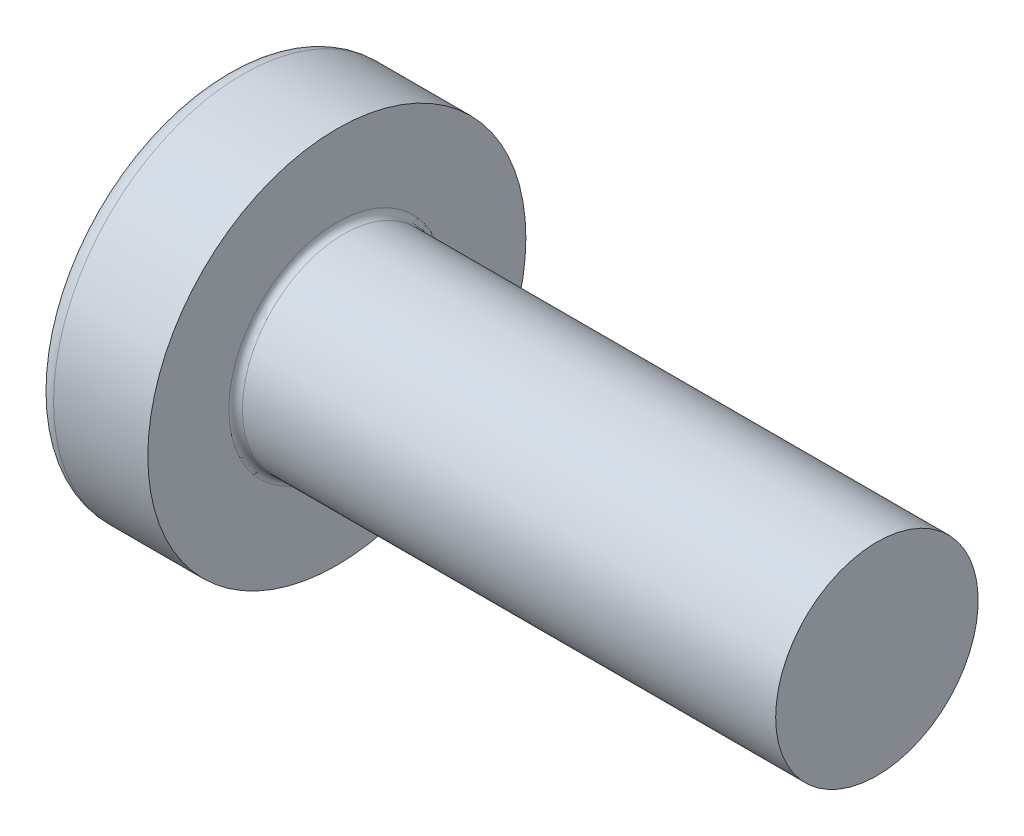
ISO-10303-21;
HEADER;
FILE_DESCRIPTION(('STEP AP214'),'2;1');
FILE_NAME('part.step','',(''),(''),'','','');
FILE_SCHEMA(('AUTOMOTIVE_DESIGN { 1 0 10303 214 1 1 1 1 }'));
ENDSEC;
DATA;
#1=APPLICATION_CONTEXT('core data for automotive mechanical design processes');
#2=APPLICATION_PROTOCOL_DEFINITION('international standard','automotive_design',2000,#1);
#3=PRODUCT_CONTEXT('',#1,'mechanical');
#4=PRODUCT('Part','Part','',(#3));
#5=PRODUCT_RELATED_PRODUCT_CATEGORY('part','',(#4));
#6=PRODUCT_DEFINITION_FORMATION('','',#4);
#7=PRODUCT_DEFINITION_CONTEXT('part definition',#1,'design');
#8=PRODUCT_DEFINITION('design','',#6,#7);
#9=PRODUCT_DEFINITION_SHAPE('','',#8);
#10=(LENGTH_UNIT() NAMED_UNIT(*) SI_UNIT(.MILLI.,.METRE.));
#11=(NAMED_UNIT(*) PLANE_ANGLE_UNIT() SI_UNIT($,.RADIAN.));
#12=(NAMED_UNIT(*) SI_UNIT($,.STERADIAN.) SOLID_ANGLE_UNIT());
#13=UNCERTAINTY_MEASURE_WITH_UNIT(LENGTH_MEASURE(1.E-05),#10,'distance_accuracy_value','');
#14=(GEOMETRIC_REPRESENTATION_CONTEXT(3) GLOBAL_UNCERTAINTY_ASSIGNED_CONTEXT((#13)) GLOBAL_UNIT_ASSIGNED_CONTEXT((#10,
#11,#12)) REPRESENTATION_CONTEXT('',''));
#15=CARTESIAN_POINT('',(0.,0.,0.));
#16=DIRECTION('',(0.,0.,1.));
#17=DIRECTION('',(1.,0.,0.));
#18=AXIS2_PLACEMENT_3D('',#15,#16,#17);
#19=CARTESIAN_POINT('',(5.,0.,0.));
#20=DIRECTION('',(-1.,0.,0.));
#21=DIRECTION('',(0.,1.,0.));
#22=AXIS2_PLACEMENT_3D('',#19,#20,#21);
#23=SPHERICAL_SURFACE('',#22,5.);
#24=CARTESIAN_POINT('',(0.775371598933733,0.,0.));
#25=DIRECTION('',(-1.,0.,0.));
#26=DIRECTION('',(0.,0.,1.));
#27=AXIS2_PLACEMENT_3D('',#24,#25,#26);
#28=CIRCLE('',#27,2.67441860465116);
#29=CARTESIAN_POINT('',(0.775371598933733,0.,2.67441860465116));
#30=VERTEX_POINT('',#29);
#31=EDGE_CURVE('E237',#30,#30,#28,.T.);
#32=ORIENTED_EDGE('',*,*,#31,.T.);
#33=EDGE_LOOP('',(#32));
#34=FACE_BOUND('',#33,.T.);
#35=CARTESIAN_POINT('',(0.0457951200896417,0.,0.));
#36=DIRECTION('',(1.,0.,0.));
#37=DIRECTION('',(0.,0.,-1.));
#38=AXIS2_PLACEMENT_3D('',#35,#36,#37);
#39=CIRCLE('',#38,0.675169614150692);
#40=CARTESIAN_POINT('',(0.0457951200896434,-0.369999999999998,-0.564760133040918));
#41=VERTEX_POINT('',#40);
#42=CARTESIAN_POINT('',(0.0457951200896417,-0.564760133040916,-0.37));
#43=VERTEX_POINT('',#42);
#44=EDGE_CURVE('E373',#41,#43,#39,.F.);
#45=ORIENTED_EDGE('',*,*,#44,.F.);
#46=CARTESIAN_POINT('',(5.,-0.37,0.));
#47=DIRECTION('',(0.,1.,0.));
#48=DIRECTION('',(0.,0.,1.));
#49=AXIS2_PLACEMENT_3D('',#46,#47,#48);
#50=CIRCLE('',#49,4.98629120689917);
#51=CARTESIAN_POINT('',(0.18786973422864,-0.369999999999995,-1.30633162146802));
#52=VERTEX_POINT('',#51);
#53=EDGE_CURVE('E299',#52,#41,#50,.T.);
#54=ORIENTED_EDGE('',*,*,#53,.F.);
#55=CARTESIAN_POINT('',(4.56358262530798,0.,0.87531798330592));
#56=DIRECTION('',(0.446197753347436,0.,-0.894934391398443));
#57=DIRECTION('',(-0.894934391398442,0.,-0.446197753347436));
#58=AXIS2_PLACEMENT_3D('',#55,#56,#57);
#59=CIRCLE('',#58,4.90340272700175);
#60=CARTESIAN_POINT('',(0.18786973422864,0.370000000000005,-1.30633162146802));
#61=VERTEX_POINT('',#60);
#62=EDGE_CURVE('E271',#52,#61,#59,.T.);
#63=ORIENTED_EDGE('',*,*,#62,.T.);
#64=CARTESIAN_POINT('',(5.,0.37,0.));
#65=DIRECTION('',(0.,-1.,0.));
#66=DIRECTION('',(0.,0.,-1.));
#67=AXIS2_PLACEMENT_3D('',#64,#65,#66);
#68=CIRCLE('',#67,4.98629120689917);
#69=CARTESIAN_POINT('',(0.0457951200896425,0.370000000000002,-0.564760133040916));
#70=VERTEX_POINT('',#69);
#71=EDGE_CURVE('E326',#70,#61,#68,.T.);
#72=ORIENTED_EDGE('',*,*,#71,.F.);
#73=CARTESIAN_POINT('',(0.0457951200896417,0.564760133040915,-0.37));
#74=VERTEX_POINT('',#73);
#75=EDGE_CURVE('E392',#74,#70,#39,.F.);
#76=ORIENTED_EDGE('',*,*,#75,.F.);
#77=CARTESIAN_POINT('',(5.,0.,-0.37));
#78=DIRECTION('',(0.,0.,1.));
#79=DIRECTION('',(1.,0.,0.));
#80=AXIS2_PLACEMENT_3D('',#77,#78,#79);
#81=CIRCLE('',#80,4.98629120689917);
#82=CARTESIAN_POINT('',(0.18786973422864,1.30633162146802,-0.37));
#83=VERTEX_POINT('',#82);
#84=EDGE_CURVE('E265',#83,#74,#81,.T.);
#85=ORIENTED_EDGE('',*,*,#84,.F.);
#86=CARTESIAN_POINT('',(4.56358262530798,-0.875317983305919,0.));
#87=DIRECTION('',(0.446197753347436,0.894934391398443,0.));
#88=DIRECTION('',(-0.894934391398443,0.446197753347436,0.));
#89=AXIS2_PLACEMENT_3D('',#86,#87,#88);
#90=CIRCLE('',#89,4.90340272700175);
#91=CARTESIAN_POINT('',(0.18786973422864,1.30633162146802,0.37));
#92=VERTEX_POINT('',#91);
#93=EDGE_CURVE('E268',#83,#92,#90,.T.);
#94=ORIENTED_EDGE('',*,*,#93,.T.);
#95=CARTESIAN_POINT('',(5.,0.,0.37));
#96=DIRECTION('',(0.,0.,-1.));
#97=DIRECTION('',(0.,1.,0.));
#98=AXIS2_PLACEMENT_3D('',#95,#96,#97);
#99=CIRCLE('',#98,4.98629120689917);
#100=CARTESIAN_POINT('',(0.0457951200896417,0.564760133040911,0.37));
#101=VERTEX_POINT('',#100);
#102=EDGE_CURVE('E261',#101,#92,#99,.T.);
#103=ORIENTED_EDGE('',*,*,#102,.F.);
#104=CARTESIAN_POINT('',(0.0457951200896434,0.369999999999998,0.564760133040918));
#105=VERTEX_POINT('',#104);
#106=EDGE_CURVE('E391',#105,#101,#39,.F.);
#107=ORIENTED_EDGE('',*,*,#106,.F.);
#108=CARTESIAN_POINT('',(0.187869734228641,0.369999999999995,1.30633162146802));
#109=VERTEX_POINT('',#108);
#110=EDGE_CURVE('E281',#109,#105,#68,.T.);
#111=ORIENTED_EDGE('',*,*,#110,.F.);
#112=CARTESIAN_POINT('',(4.56358262530798,0.,-0.875317983305919));
#113=DIRECTION('',(0.446197753347436,0.,0.894934391398443));
#114=DIRECTION('',(0.894934391398443,0.,-0.446197753347436));
#115=AXIS2_PLACEMENT_3D('',#112,#113,#114);
#116=CIRCLE('',#115,4.90340272700175);
#117=CARTESIAN_POINT('',(0.187869734228641,-0.370000000000005,1.30633162146802));
#118=VERTEX_POINT('',#117);
#119=EDGE_CURVE('E48',#109,#118,#116,.T.);
#120=ORIENTED_EDGE('',*,*,#119,.T.);
#121=CARTESIAN_POINT('',(0.0457951200896429,-0.370000000000002,0.564760133040916));
#122=VERTEX_POINT('',#121);
#123=EDGE_CURVE('E278',#122,#118,#50,.T.);
#124=ORIENTED_EDGE('',*,*,#123,.F.);
#125=CARTESIAN_POINT('',(0.0457951200896417,-0.564760133040912,0.37));
#126=VERTEX_POINT('',#125);
#127=EDGE_CURVE('E427',#126,#122,#39,.F.);
#128=ORIENTED_EDGE('',*,*,#127,.F.);
#129=CARTESIAN_POINT('',(0.18786973422864,-1.30633162146802,0.37));
#130=VERTEX_POINT('',#129);
#131=EDGE_CURVE('E262',#130,#126,#99,.T.);
#132=ORIENTED_EDGE('',*,*,#131,.F.);
#133=CARTESIAN_POINT('',(4.56358262530798,0.87531798330592,0.));
#134=DIRECTION('',(0.446197753347436,-0.894934391398443,0.));
#135=DIRECTION('',(0.894934391398442,0.446197753347436,0.));
#136=AXIS2_PLACEMENT_3D('',#133,#134,#135);
#137=CIRCLE('',#136,4.90340272700175);
#138=CARTESIAN_POINT('',(0.18786973422864,-1.30633162146802,-0.37));
#139=VERTEX_POINT('',#138);
#140=EDGE_CURVE('E258',#130,#139,#137,.T.);
#141=ORIENTED_EDGE('',*,*,#140,.T.);
#142=EDGE_CURVE('E63',#43,#139,#81,.T.);
#143=ORIENTED_EDGE('',*,*,#142,.F.);
#144=EDGE_LOOP('',(#45,#54,#63,#72,#76,#85,#94,#103,#107,#111,#120,#124,#128,#132,#141,#143));
#145=FACE_BOUND('',#144,.T.);
#146=ADVANCED_FACE('F35',(#34,#145),#23,.T.);
#147=CARTESIAN_POINT('',(1.75,0.527482331818931,-0.37));
#148=DIRECTION('',(0.,0.,1.));
#149=DIRECTION('',(1.,0.,0.));
#150=AXIS2_PLACEMENT_3D('',#147,#148,#149);
#151=PLANE('',#150);
#152=ORIENTED_EDGE('',*,*,#84,.T.);
#153=CARTESIAN_POINT('',(-0.987293237053716,0.649401255967161,-0.37));
#154=CARTESIAN_POINT('',(-0.781914975317084,0.632865887002871,-0.37));
#155=CARTESIAN_POINT('',(-0.576547882393372,0.616188977635081,-0.37));
#156=CARTESIAN_POINT('',(-0.165841599226327,0.582441031964227,-0.37));
#157=CARTESIAN_POINT('',(0.0394975903090452,0.56536998705488,-0.37));
#158=CARTESIAN_POINT('',(0.450133475422572,0.530723441326535,-0.37));
#159=CARTESIAN_POINT('',(0.655430171010573,0.513147940624557,-0.37));
#160=CARTESIAN_POINT('',(1.06596140177934,0.477314957985794,-0.37));
#161=CARTESIAN_POINT('',(1.2711959378071,0.459057485806066,-0.37));
#162=CARTESIAN_POINT('',(1.61065292365626,0.428051938688768,-0.37));
#163=CARTESIAN_POINT('',(1.74490059995643,0.415580824990931,-0.37));
#164=CARTESIAN_POINT('',(2.01334321762763,0.390092023404979,-0.37));
#165=CARTESIAN_POINT('',(2.14753815934577,0.377074339177353,-0.37));
#166=CARTESIAN_POINT('',(2.41586354151957,0.350315629452843,-0.37));
#167=CARTESIAN_POINT('',(2.5499939784531,0.33657456817765,-0.37));
#168=CARTESIAN_POINT('',(2.81814173295471,0.308004077741875,-0.37));
#169=CARTESIAN_POINT('',(2.95215904765134,0.293174621747065,-0.37));
#170=CARTESIAN_POINT('',(3.0860955068368,0.277618485071816,-0.37));
#171=B_SPLINE_CURVE_WITH_KNOTS('',3,(#153,#154,#155,#156,#157,#158,#159,#160,#161,#162,#163,
#164,#165,#166,#167,#168,#169,#170),.UNSPECIFIED.,.F.,.F.,(4,2,2,2,2,2,2,2,4),(0.,
0.618128793984691,1.23627109812525,1.85441325887562,2.4725465791681,2.87702276218609,
3.28149623678161,3.68598973550942,4.09049321032311),.UNSPECIFIED.);
#172=CARTESIAN_POINT('',(1.75,0.415013252800437,-0.37));
#173=VERTEX_POINT('',#172);
#174=EDGE_CURVE('E413',#74,#173,#171,.T.);
#175=ORIENTED_EDGE('',*,*,#174,.T.);
#176=DIRECTION('',(0.,1.,0.));
#177=VECTOR('',#176,1.);
#178=CARTESIAN_POINT('',(1.75,-0.527482331818931,-0.37));
#179=LINE('',#178,#177);
#180=CARTESIAN_POINT('',(1.75,0.527482331818932,-0.37));
#181=VERTEX_POINT('',#180);
#182=EDGE_CURVE('E355',#173,#181,#179,.T.);
#183=ORIENTED_EDGE('',*,*,#182,.T.);
#184=DIRECTION('',(0.894934391398442,-0.446197753347436,0.));
#185=VECTOR('',#184,1.);
#186=CARTESIAN_POINT('',(0.,1.4,-0.37));
#187=LINE('',#186,#185);
#188=EDGE_CURVE('E238',#83,#181,#187,.T.);
#189=ORIENTED_EDGE('',*,*,#188,.F.);
#190=EDGE_LOOP('',(#152,#175,#183,#189));
#191=FACE_BOUND('',#190,.T.);
#192=ADVANCED_FACE('F193',(#191),#151,.T.);
#193=CARTESIAN_POINT('',(1.75,-0.527482331818931,-0.37));
#194=VERTEX_POINT('',#193);
#195=CARTESIAN_POINT('',(1.75,-0.415013252800437,-0.37));
#196=VERTEX_POINT('',#195);
#197=EDGE_CURVE('E246',#194,#196,#179,.T.);
#198=ORIENTED_EDGE('',*,*,#197,.T.);
#199=CARTESIAN_POINT('',(-0.987293237053716,-0.649401255967161,-0.37));
#200=CARTESIAN_POINT('',(-0.781914975317084,-0.632865887002871,-0.37));
#201=CARTESIAN_POINT('',(-0.576547882393372,-0.616188977635081,-0.37));
#202=CARTESIAN_POINT('',(-0.165841599226327,-0.582441031964227,-0.37));
#203=CARTESIAN_POINT('',(0.0394975903090452,-0.56536998705488,-0.37));
#204=CARTESIAN_POINT('',(0.450133475422572,-0.530723441326535,-0.37));
#205=CARTESIAN_POINT('',(0.655430171010573,-0.513147940624557,-0.37));
#206=CARTESIAN_POINT('',(1.06596140177934,-0.477314957985794,-0.37));
#207=CARTESIAN_POINT('',(1.2711959378071,-0.459057485806066,-0.37));
#208=CARTESIAN_POINT('',(1.61065292365626,-0.428051938688768,-0.37));
#209=CARTESIAN_POINT('',(1.74490059995643,-0.415580824990931,-0.37));
#210=CARTESIAN_POINT('',(2.01334321762763,-0.390092023404979,-0.37));
#211=CARTESIAN_POINT('',(2.14753815934577,-0.377074339177353,-0.37));
#212=CARTESIAN_POINT('',(2.41586354151957,-0.350315629452843,-0.37));
#213=CARTESIAN_POINT('',(2.5499939784531,-0.33657456817765,-0.37));
#214=CARTESIAN_POINT('',(2.81814173295471,-0.308004077741875,-0.37));
#215=CARTESIAN_POINT('',(2.95215904765134,-0.293174621747065,-0.37));
#216=CARTESIAN_POINT('',(3.0860955068368,-0.277618485071816,-0.37));
#217=B_SPLINE_CURVE_WITH_KNOTS('',3,(#199,#200,#201,#202,#203,#204,#205,#206,#207,#208,#209,
#210,#211,#212,#213,#214,#215,#216),.UNSPECIFIED.,.F.,.F.,(4,2,2,2,2,2,2,2,4),(0.,
0.618128793984691,1.23627109812525,1.85441325887562,2.4725465791681,2.87702276218609,
3.28149623678161,3.68598973550942,4.09049321032311),.UNSPECIFIED.);
#218=EDGE_CURVE('E390',#196,#43,#217,.F.);
#219=ORIENTED_EDGE('',*,*,#218,.T.);
#220=ORIENTED_EDGE('',*,*,#142,.T.);
#221=DIRECTION('',(0.894934391398442,0.446197753347436,0.));
#222=VECTOR('',#221,1.);
#223=CARTESIAN_POINT('',(0.,-1.4,-0.37));
#224=LINE('',#223,#222);
#225=EDGE_CURVE('E329',#139,#194,#224,.T.);
#226=ORIENTED_EDGE('',*,*,#225,.T.);
#227=EDGE_LOOP('',(#198,#219,#220,#226));
#228=FACE_BOUND('',#227,.T.);
#229=ADVANCED_FACE('F199',(#228),#151,.T.);
#230=CARTESIAN_POINT('',(1.75,-0.527482331818931,0.37));
#231=DIRECTION('',(0.,0.,-1.));
#232=DIRECTION('',(0.,1.,0.));
#233=AXIS2_PLACEMENT_3D('',#230,#231,#232);
#234=PLANE('',#233);
#235=DIRECTION('',(0.,-1.,0.));
#236=VECTOR('',#235,1.);
#237=CARTESIAN_POINT('',(1.75,0.527482331818931,0.37));
#238=LINE('',#237,#236);
#239=CARTESIAN_POINT('',(1.75,0.527482331818932,0.37));
#240=VERTEX_POINT('',#239);
#241=CARTESIAN_POINT('',(1.75,0.415013252800437,0.37));
#242=VERTEX_POINT('',#241);
#243=EDGE_CURVE('E338',#240,#242,#238,.T.);
#244=ORIENTED_EDGE('',*,*,#243,.T.);
#245=CARTESIAN_POINT('',(-0.987293237053716,0.649401255967161,0.37));
#246=CARTESIAN_POINT('',(-0.781914975317084,0.632865887002871,0.37));
#247=CARTESIAN_POINT('',(-0.576547882393372,0.616188977635081,0.37));
#248=CARTESIAN_POINT('',(-0.165841599226327,0.582441031964227,0.37));
#249=CARTESIAN_POINT('',(0.0394975903090453,0.56536998705488,0.37));
#250=CARTESIAN_POINT('',(0.450133475422572,0.530723441326535,0.37));
#251=CARTESIAN_POINT('',(0.655430171010574,0.513147940624557,0.37));
#252=CARTESIAN_POINT('',(1.06596140177934,0.477314957985794,0.37));
#253=CARTESIAN_POINT('',(1.2711959378071,0.459057485806066,0.37));
#254=CARTESIAN_POINT('',(1.61065292365626,0.428051938688768,0.37));
#255=CARTESIAN_POINT('',(1.74490059995643,0.415580824990931,0.37));
#256=CARTESIAN_POINT('',(2.01334321762763,0.39009202340498,0.37));
#257=CARTESIAN_POINT('',(2.14753815934577,0.377074339177353,0.37));
#258=CARTESIAN_POINT('',(2.41586354151957,0.350315629452843,0.37));
#259=CARTESIAN_POINT('',(2.5499939784531,0.33657456817765,0.37));
#260=CARTESIAN_POINT('',(2.81814173295471,0.308004077741875,0.37));
#261=CARTESIAN_POINT('',(2.95215904765134,0.293174621747065,0.37));
#262=CARTESIAN_POINT('',(3.0860955068368,0.277618485071816,0.37));
#263=B_SPLINE_CURVE_WITH_KNOTS('',3,(#245,#246,#247,#248,#249,#250,#251,#252,#253,#254,#255,
#256,#257,#258,#259,#260,#261,#262),.UNSPECIFIED.,.F.,.F.,(4,2,2,2,2,2,2,2,4),(0.,
0.618128793984691,1.23627109812525,1.85441325887562,2.4725465791681,2.87702276218609,
3.28149623678161,3.68598973550942,4.09049321032311),.UNSPECIFIED.);
#264=EDGE_CURVE('E665',#242,#101,#263,.F.);
#265=ORIENTED_EDGE('',*,*,#264,.T.);
#266=ORIENTED_EDGE('',*,*,#102,.T.);
#267=DIRECTION('',(0.894934391398442,-0.446197753347436,0.));
#268=VECTOR('',#267,1.);
#269=CARTESIAN_POINT('',(0.,1.4,0.37));
#270=LINE('',#269,#268);
#271=EDGE_CURVE('E243',#92,#240,#270,.T.);
#272=ORIENTED_EDGE('',*,*,#271,.T.);
#273=EDGE_LOOP('',(#244,#265,#266,#272));
#274=FACE_BOUND('',#273,.T.);
#275=ADVANCED_FACE('F409',(#274),#234,.T.);
#276=ORIENTED_EDGE('',*,*,#131,.T.);
#277=CARTESIAN_POINT('',(-0.987293237069635,-0.649401255968442,0.37));
#278=CARTESIAN_POINT('',(-0.781914975331301,-0.632865887004023,0.37));
#279=CARTESIAN_POINT('',(-0.576547882405888,-0.616188977636102,0.37));
#280=CARTESIAN_POINT('',(-0.16584159923544,-0.582441031964983,0.37));
#281=CARTESIAN_POINT('',(0.0394975903016338,-0.5653699870555,0.37));
#282=CARTESIAN_POINT('',(0.450133475420601,-0.530723441326706,0.37));
#283=CARTESIAN_POINT('',(0.655430171012341,-0.513147940624409,0.37));
#284=CARTESIAN_POINT('',(1.06596140178858,-0.477314957984981,0.37));
#285=CARTESIAN_POINT('',(1.27119593782008,-0.459057485804908,0.37));
#286=CARTESIAN_POINT('',(1.61065292367297,-0.428051938687225,0.37));
#287=CARTESIAN_POINT('',(1.74490059997313,-0.415580824989368,0.37));
#288=CARTESIAN_POINT('',(2.01334321764434,-0.390092023403371,0.37));
#289=CARTESIAN_POINT('',(2.14753815936247,-0.377074339175718,0.37));
#290=CARTESIAN_POINT('',(2.41586354153627,-0.350315629451146,0.37));
#291=CARTESIAN_POINT('',(2.54999397846979,-0.336574568175918,0.37));
#292=CARTESIAN_POINT('',(2.8181417329714,-0.308004077740054,0.37));
#293=CARTESIAN_POINT('',(2.95215904766802,-0.29317462174519,0.37));
#294=CARTESIAN_POINT('',(3.08609550685347,-0.277618485069873,0.37));
#295=B_SPLINE_CURVE_WITH_KNOTS('',3,(#277,#278,#279,#280,#281,#282,#283,#284,#285,#286,#287,
#288,#289,#290,#291,#292,#293,#294),.UNSPECIFIED.,.F.,.F.,(4,2,2,2,2,2,2,2,4),(0.,
0.61812879398981,1.23627109813549,1.85441325889711,2.47254657920086,2.87702276221884,
3.28149623681437,3.68598973554218,4.09049321035586),.UNSPECIFIED.);
#296=CARTESIAN_POINT('',(1.75,-0.415013252800437,0.37));
#297=VERTEX_POINT('',#296);
#298=EDGE_CURVE('E428',#126,#297,#295,.T.);
#299=ORIENTED_EDGE('',*,*,#298,.T.);
#300=CARTESIAN_POINT('',(1.75,-0.527482331818931,0.37));
#301=VERTEX_POINT('',#300);
#302=EDGE_CURVE('E340',#297,#301,#238,.T.);
#303=ORIENTED_EDGE('',*,*,#302,.T.);
#304=DIRECTION('',(0.894934391398442,0.446197753347436,0.));
#305=VECTOR('',#304,1.);
#306=CARTESIAN_POINT('',(0.,-1.4,0.37));
#307=LINE('',#306,#305);
#308=EDGE_CURVE('E331',#130,#301,#307,.T.);
#309=ORIENTED_EDGE('',*,*,#308,.F.);
#310=EDGE_LOOP('',(#276,#299,#303,#309));
#311=FACE_BOUND('',#310,.T.);
#312=ADVANCED_FACE('F513',(#311),#234,.T.);
#313=CARTESIAN_POINT('',(1.75,0.527482331818931,0.37));
#314=DIRECTION('',(0.446197753347436,0.894934391398443,0.));
#315=DIRECTION('',(-0.894934391398443,0.446197753347436,0.));
#316=AXIS2_PLACEMENT_3D('',#313,#314,#315);
#317=PLANE('',#316);
#318=CARTESIAN_POINT('',(2.6696526882832,0.0689604923233252,0.));
#319=DIRECTION('',(0.446197753347436,0.894934391398443,0.));
#320=DIRECTION('',(-0.894934391398443,0.446197753347436,0.));
#321=AXIS2_PLACEMENT_3D('',#318,#319,#320);
#322=ELLIPSE('',#321,1.10195897609154,0.486831694838766);
#323=CARTESIAN_POINT('',(1.75,0.527482331818932,0.175779377683681));
#324=VERTEX_POINT('',#323);
#325=CARTESIAN_POINT('',(1.75,0.527482331818932,-0.175779377683681));
#326=VERTEX_POINT('',#325);
#327=EDGE_CURVE('E304',#324,#326,#322,.F.);
#328=ORIENTED_EDGE('',*,*,#327,.F.);
#329=DIRECTION('',(0.,0.,-1.));
#330=VECTOR('',#329,1.);
#331=CARTESIAN_POINT('',(1.75,0.527482331818931,0.37));
#332=LINE('',#331,#330);
#333=EDGE_CURVE('E341',#240,#324,#332,.T.);
#334=ORIENTED_EDGE('',*,*,#333,.F.);
#335=ORIENTED_EDGE('',*,*,#271,.F.);
#336=ORIENTED_EDGE('',*,*,#93,.F.);
#337=ORIENTED_EDGE('',*,*,#188,.T.);
#338=EDGE_CURVE('E343',#326,#181,#332,.T.);
#339=ORIENTED_EDGE('',*,*,#338,.F.);
#340=EDGE_LOOP('',(#328,#334,#335,#336,#337,#339));
#341=FACE_BOUND('',#340,.T.);
#342=ADVANCED_FACE('F407',(#341),#317,.F.);
#343=CARTESIAN_POINT('',(0.,-1.4,-0.37));
#344=DIRECTION('',(0.446197753347436,-0.894934391398443,0.));
#345=DIRECTION('',(0.894934391398442,0.446197753347436,0.));
#346=AXIS2_PLACEMENT_3D('',#343,#344,#345);
#347=PLANE('',#346);
#348=CARTESIAN_POINT('',(2.6696526882832,-0.0689604923233248,0.));
#349=DIRECTION('',(0.446197753347436,-0.894934391398443,0.));
#350=DIRECTION('',(-0.894934391398443,-0.446197753347436,0.));
#351=AXIS2_PLACEMENT_3D('',#348,#349,#350);
#352=ELLIPSE('',#351,1.10195897609154,0.486831694838766);
#353=CARTESIAN_POINT('',(1.75,-0.527482331818932,-0.175779377683682));
#354=VERTEX_POINT('',#353);
#355=CARTESIAN_POINT('',(1.75,-0.527482331818932,0.175779377683682));
#356=VERTEX_POINT('',#355);
#357=EDGE_CURVE('E667',#354,#356,#352,.F.);
#358=ORIENTED_EDGE('',*,*,#357,.F.);
#359=DIRECTION('',(0.,0.,1.));
#360=VECTOR('',#359,1.);
#361=CARTESIAN_POINT('',(1.75,-0.527482331818931,-0.37));
#362=LINE('',#361,#360);
#363=EDGE_CURVE('E334',#194,#354,#362,.T.);
#364=ORIENTED_EDGE('',*,*,#363,.F.);
#365=ORIENTED_EDGE('',*,*,#225,.F.);
#366=ORIENTED_EDGE('',*,*,#140,.F.);
#367=ORIENTED_EDGE('',*,*,#308,.T.);
#368=EDGE_CURVE('E337',#356,#301,#362,.T.);
#369=ORIENTED_EDGE('',*,*,#368,.F.);
#370=EDGE_LOOP('',(#358,#364,#365,#366,#367,#369));
#371=FACE_BOUND('',#370,.T.);
#372=ADVANCED_FACE('F500',(#371),#347,.F.);
#373=CARTESIAN_POINT('',(1.75,0.527482331818931,-0.37));
#374=DIRECTION('',(-1.,0.,0.));
#375=DIRECTION('',(0.,0.,1.));
#376=AXIS2_PLACEMENT_3D('',#373,#374,#375);
#377=PLANE('',#376);
#378=DIRECTION('',(0.,1.,0.));
#379=VECTOR('',#378,1.);
#380=CARTESIAN_POINT('',(1.75,-0.370000000000002,0.52748233181893));
#381=LINE('',#380,#379);
#382=CARTESIAN_POINT('',(1.75,-0.370000000000002,0.52748233181893));
#383=VERTEX_POINT('',#382);
#384=CARTESIAN_POINT('',(1.75,-0.175779377683684,0.527482331818931));
#385=VERTEX_POINT('',#384);
#386=EDGE_CURVE('E319',#383,#385,#381,.T.);
#387=ORIENTED_EDGE('',*,*,#386,.T.);
#388=CARTESIAN_POINT('',(1.75,0.,0.));
#389=DIRECTION('',(-1.,0.,0.));
#390=DIRECTION('',(0.,0.,1.));
#391=AXIS2_PLACEMENT_3D('',#388,#389,#390);
#392=CIRCLE('',#391,0.556);
#393=CARTESIAN_POINT('',(1.75,-0.370000000000001,0.415013252800436));
#394=VERTEX_POINT('',#393);
#395=EDGE_CURVE('E693',#394,#385,#392,.T.);
#396=ORIENTED_EDGE('',*,*,#395,.F.);
#397=DIRECTION('',(0.,0.,-1.));
#398=VECTOR('',#397,1.);
#399=CARTESIAN_POINT('',(1.75,-0.370000000000002,0.52748233181893));
#400=LINE('',#399,#398);
#401=EDGE_CURVE('E315',#383,#394,#400,.T.);
#402=ORIENTED_EDGE('',*,*,#401,.F.);
#403=EDGE_LOOP('',(#387,#396,#402));
#404=FACE_BOUND('',#403,.T.);
#405=ADVANCED_FACE('F493',(#404),#377,.T.);
#406=ORIENTED_EDGE('',*,*,#302,.F.);
#407=EDGE_CURVE('E698',#356,#297,#392,.T.);
#408=ORIENTED_EDGE('',*,*,#407,.F.);
#409=ORIENTED_EDGE('',*,*,#368,.T.);
#410=EDGE_LOOP('',(#406,#408,#409));
#411=FACE_BOUND('',#410,.T.);
#412=ADVANCED_FACE('F486',(#411),#377,.T.);
#413=ORIENTED_EDGE('',*,*,#363,.T.);
#414=EDGE_CURVE('E384',#196,#354,#392,.T.);
#415=ORIENTED_EDGE('',*,*,#414,.F.);
#416=ORIENTED_EDGE('',*,*,#197,.F.);
#417=EDGE_LOOP('',(#413,#415,#416));
#418=FACE_BOUND('',#417,.T.);
#419=ADVANCED_FACE('F480',(#418),#377,.T.);
#420=CARTESIAN_POINT('',(1.75,-0.369999999999998,-0.415013252800438));
#421=VERTEX_POINT('',#420);
#422=CARTESIAN_POINT('',(1.75,-0.369999999999998,-0.527482331818932));
#423=VERTEX_POINT('',#422);
#424=EDGE_CURVE('E318',#421,#423,#400,.T.);
#425=ORIENTED_EDGE('',*,*,#424,.F.);
#426=CARTESIAN_POINT('',(1.75,-0.175779377683682,-0.527482331818932));
#427=VERTEX_POINT('',#426);
#428=EDGE_CURVE('E55',#427,#421,#392,.T.);
#429=ORIENTED_EDGE('',*,*,#428,.F.);
#430=DIRECTION('',(0.,-1.,0.));
#431=VECTOR('',#430,1.);
#432=CARTESIAN_POINT('',(1.75,0.370000000000002,-0.52748233181893));
#433=LINE('',#432,#431);
#434=EDGE_CURVE('E314',#427,#423,#433,.T.);
#435=ORIENTED_EDGE('',*,*,#434,.T.);
#436=EDGE_LOOP('',(#425,#429,#435));
#437=FACE_BOUND('',#436,.T.);
#438=ADVANCED_FACE('F379',(#437),#377,.T.);
#439=CARTESIAN_POINT('',(1.75,0.370000000000002,-0.52748233181893));
#440=VERTEX_POINT('',#439);
#441=CARTESIAN_POINT('',(1.75,0.175779377683685,-0.527482331818931));
#442=VERTEX_POINT('',#441);
#443=EDGE_CURVE('E311',#440,#442,#433,.T.);
#444=ORIENTED_EDGE('',*,*,#443,.T.);
#445=CARTESIAN_POINT('',(1.75,0.370000000000001,-0.415013252800436));
#446=VERTEX_POINT('',#445);
#447=EDGE_CURVE('E383',#446,#442,#392,.T.);
#448=ORIENTED_EDGE('',*,*,#447,.F.);
#449=DIRECTION('',(0.,0.,1.));
#450=VECTOR('',#449,1.);
#451=CARTESIAN_POINT('',(1.75,0.370000000000002,-0.52748233181893));
#452=LINE('',#451,#450);
#453=EDGE_CURVE('E323',#440,#446,#452,.T.);
#454=ORIENTED_EDGE('',*,*,#453,.F.);
#455=EDGE_LOOP('',(#444,#448,#454));
#456=FACE_BOUND('',#455,.T.);
#457=ADVANCED_FACE('F468',(#456),#377,.T.);
#458=ORIENTED_EDGE('',*,*,#182,.F.);
#459=EDGE_CURVE('E682',#326,#173,#392,.T.);
#460=ORIENTED_EDGE('',*,*,#459,.F.);
#461=ORIENTED_EDGE('',*,*,#338,.T.);
#462=EDGE_LOOP('',(#458,#460,#461));
#463=FACE_BOUND('',#462,.T.);
#464=ADVANCED_FACE('F461',(#463),#377,.T.);
#465=ORIENTED_EDGE('',*,*,#333,.T.);
#466=EDGE_CURVE('E684',#242,#324,#392,.T.);
#467=ORIENTED_EDGE('',*,*,#466,.F.);
#468=ORIENTED_EDGE('',*,*,#243,.F.);
#469=EDGE_LOOP('',(#465,#467,#468));
#470=FACE_BOUND('',#469,.T.);
#471=ADVANCED_FACE('F455',(#470),#377,.T.);
#472=CARTESIAN_POINT('',(1.75,0.369999999999998,0.527482331818933));
#473=DIRECTION('',(0.,-1.,0.));
#474=DIRECTION('',(1.,0.,0.));
#475=AXIS2_PLACEMENT_3D('',#472,#473,#474);
#476=PLANE('',#475);
#477=ORIENTED_EDGE('',*,*,#110,.T.);
#478=CARTESIAN_POINT('',(-0.987293237069635,0.369999999999998,0.649401255968443));
#479=CARTESIAN_POINT('',(-0.781914975331301,0.369999999999998,0.632865887004024));
#480=CARTESIAN_POINT('',(-0.576547882405888,0.369999999999998,0.616188977636103));
#481=CARTESIAN_POINT('',(-0.16584159923544,0.369999999999998,0.582441031964984));
#482=CARTESIAN_POINT('',(0.0394975903016338,0.369999999999998,0.565369987055501));
#483=CARTESIAN_POINT('',(0.450133475420601,0.369999999999998,0.530723441326707));
#484=CARTESIAN_POINT('',(0.655430171012341,0.369999999999998,0.51314794062441));
#485=CARTESIAN_POINT('',(1.06596140178858,0.369999999999998,0.477314957984982));
#486=CARTESIAN_POINT('',(1.27119593782008,0.369999999999998,0.459057485804909));
#487=CARTESIAN_POINT('',(1.61065292367297,0.369999999999999,0.428051938687226));
#488=CARTESIAN_POINT('',(1.74490059997313,0.369999999999999,0.415580824989369));
#489=CARTESIAN_POINT('',(2.01334321764434,0.369999999999999,0.390092023403372));
#490=CARTESIAN_POINT('',(2.14753815936247,0.369999999999999,0.37707433917572));
#491=CARTESIAN_POINT('',(2.41586354153627,0.369999999999999,0.350315629451147));
#492=CARTESIAN_POINT('',(2.54999397846979,0.369999999999999,0.336574568175919));
#493=CARTESIAN_POINT('',(2.8181417329714,0.369999999999999,0.308004077740055));
#494=CARTESIAN_POINT('',(2.95215904766802,0.369999999999999,0.293174621745191));
#495=CARTESIAN_POINT('',(3.08609550685347,0.369999999999999,0.277618485069875));
#496=B_SPLINE_CURVE_WITH_KNOTS('',3,(#478,#479,#480,#481,#482,#483,#484,#485,#486,#487,#488,
#489,#490,#491,#492,#493,#494,#495),.UNSPECIFIED.,.F.,.F.,(4,2,2,2,2,2,2,2,4),(0.,
0.61812879398981,1.23627109813549,1.85441325889711,2.47254657920086,2.87702276221884,
3.28149623681436,3.68598973554218,4.09049321035586),.UNSPECIFIED.);
#497=CARTESIAN_POINT('',(1.75,0.369999999999999,0.415013252800439));
#498=VERTEX_POINT('',#497);
#499=EDGE_CURVE('E664',#105,#498,#496,.T.);
#500=ORIENTED_EDGE('',*,*,#499,.T.);
#501=CARTESIAN_POINT('',(1.75,0.369999999999998,0.527482331818933));
#502=VERTEX_POINT('',#501);
#503=EDGE_CURVE('E296',#498,#502,#452,.T.);
#504=ORIENTED_EDGE('',*,*,#503,.T.);
#505=DIRECTION('',(0.894934391398442,0.,-0.446197753347436));
#506=VECTOR('',#505,1.);
#507=CARTESIAN_POINT('',(0.,0.369999999999995,1.4));
#508=LINE('',#507,#506);
#509=EDGE_CURVE('E289',#109,#502,#508,.T.);
#510=ORIENTED_EDGE('',*,*,#509,.F.);
#511=EDGE_LOOP('',(#477,#500,#504,#510));
#512=FACE_BOUND('',#511,.T.);
#513=ADVANCED_FACE('F293',(#512),#476,.T.);
#514=CARTESIAN_POINT('',(1.75,-0.369999999999998,-0.527482331818932));
#515=DIRECTION('',(0.,1.,0.));
#516=DIRECTION('',(0.,0.,1.));
#517=AXIS2_PLACEMENT_3D('',#514,#515,#516);
#518=PLANE('',#517);
#519=ORIENTED_EDGE('',*,*,#401,.T.);
#520=CARTESIAN_POINT('',(-0.987293237053716,-0.370000000000002,0.64940125596716));
#521=CARTESIAN_POINT('',(-0.781914975317084,-0.370000000000002,0.63286588700287));
#522=CARTESIAN_POINT('',(-0.576547882393372,-0.370000000000002,0.61618897763508));
#523=CARTESIAN_POINT('',(-0.165841599226327,-0.370000000000002,0.582441031964225));
#524=CARTESIAN_POINT('',(0.0394975903090451,-0.370000000000002,0.565369987054878));
#525=CARTESIAN_POINT('',(0.450133475422572,-0.370000000000002,0.530723441326533));
#526=CARTESIAN_POINT('',(0.655430171010573,-0.370000000000002,0.513147940624555));
#527=CARTESIAN_POINT('',(1.06596140177934,-0.370000000000002,0.477314957985793));
#528=CARTESIAN_POINT('',(1.2711959378071,-0.370000000000002,0.459057485806065));
#529=CARTESIAN_POINT('',(1.61065292365626,-0.370000000000001,0.428051938688767));
#530=CARTESIAN_POINT('',(1.74490059995642,-0.370000000000001,0.41558082499093));
#531=CARTESIAN_POINT('',(2.01334321762763,-0.370000000000001,0.390092023404978));
#532=CARTESIAN_POINT('',(2.14753815934577,-0.370000000000001,0.377074339177352));
#533=CARTESIAN_POINT('',(2.41586354151957,-0.370000000000001,0.350315629452841));
#534=CARTESIAN_POINT('',(2.5499939784531,-0.370000000000001,0.336574568177649));
#535=CARTESIAN_POINT('',(2.81814173295471,-0.370000000000001,0.308004077741874));
#536=CARTESIAN_POINT('',(2.95215904765134,-0.370000000000001,0.293174621747063));
#537=CARTESIAN_POINT('',(3.0860955068368,-0.370000000000001,0.277618485071814));
#538=B_SPLINE_CURVE_WITH_KNOTS('',3,(#520,#521,#522,#523,#524,#525,#526,#527,#528,#529,#530,
#531,#532,#533,#534,#535,#536,#537),.UNSPECIFIED.,.F.,.F.,(4,2,2,2,2,2,2,2,4),(0.,
0.618128793984691,1.23627109812525,1.85441325887562,2.4725465791681,2.87702276218609,
3.28149623678161,3.68598973550942,4.09049321032311),.UNSPECIFIED.);
#539=EDGE_CURVE('E421',#394,#122,#538,.F.);
#540=ORIENTED_EDGE('',*,*,#539,.T.);
#541=ORIENTED_EDGE('',*,*,#123,.T.);
#542=DIRECTION('',(0.894934391398442,0.,-0.446197753347436));
#543=VECTOR('',#542,1.);
#544=CARTESIAN_POINT('',(0.,-0.370000000000005,1.4));
#545=LINE('',#544,#543);
#546=EDGE_CURVE('E291',#118,#383,#545,.T.);
#547=ORIENTED_EDGE('',*,*,#546,.T.);
#548=EDGE_LOOP('',(#519,#540,#541,#547));
#549=FACE_BOUND('',#548,.T.);
#550=ADVANCED_FACE('F228',(#549),#518,.T.);
#551=CARTESIAN_POINT('',(1.75,-0.370000000000002,0.52748233181893));
#552=DIRECTION('',(0.446197753347436,0.,0.894934391398443));
#553=DIRECTION('',(-0.894934391398443,0.,0.446197753347436));
#554=AXIS2_PLACEMENT_3D('',#551,#552,#553);
#555=PLANE('',#554);
#556=CARTESIAN_POINT('',(2.6696526882832,0.,0.0689604923233252));
#557=DIRECTION('',(0.446197753347436,0.,0.894934391398443));
#558=DIRECTION('',(-0.894934391398443,0.,0.446197753347436));
#559=AXIS2_PLACEMENT_3D('',#556,#557,#558);
#560=ELLIPSE('',#559,1.10195897609154,0.486831694838766);
#561=CARTESIAN_POINT('',(1.75,0.175779377683681,0.527482331818932));
#562=VERTEX_POINT('',#561);
#563=EDGE_CURVE('E419',#385,#562,#560,.F.);
#564=ORIENTED_EDGE('',*,*,#563,.F.);
#565=ORIENTED_EDGE('',*,*,#386,.F.);
#566=ORIENTED_EDGE('',*,*,#546,.F.);
#567=ORIENTED_EDGE('',*,*,#119,.F.);
#568=ORIENTED_EDGE('',*,*,#509,.T.);
#569=EDGE_CURVE('E322',#562,#502,#381,.T.);
#570=ORIENTED_EDGE('',*,*,#569,.F.);
#571=EDGE_LOOP('',(#564,#565,#566,#567,#568,#570));
#572=FACE_BOUND('',#571,.T.);
#573=ADVANCED_FACE('F287',(#572),#555,.F.);
#574=CARTESIAN_POINT('',(0.,0.370000000000005,-1.4));
#575=DIRECTION('',(0.446197753347436,0.,-0.894934391398443));
#576=DIRECTION('',(0.894934391398442,0.,0.446197753347436));
#577=AXIS2_PLACEMENT_3D('',#574,#575,#576);
#578=PLANE('',#577);
#579=CARTESIAN_POINT('',(2.6696526882832,0.,-0.0689604923233248));
#580=DIRECTION('',(0.446197753347436,0.,-0.894934391398443));
#581=DIRECTION('',(-0.894934391398443,0.,-0.446197753347436));
#582=AXIS2_PLACEMENT_3D('',#579,#580,#581);
#583=ELLIPSE('',#582,1.10195897609154,0.486831694838766);
#584=EDGE_CURVE('E377',#442,#427,#583,.F.);
#585=ORIENTED_EDGE('',*,*,#584,.F.);
#586=ORIENTED_EDGE('',*,*,#443,.F.);
#587=DIRECTION('',(0.894934391398442,0.,0.446197753347436));
#588=VECTOR('',#587,1.);
#589=CARTESIAN_POINT('',(0.,0.370000000000005,-1.4));
#590=LINE('',#589,#588);
#591=EDGE_CURVE('E301',#61,#440,#590,.T.);
#592=ORIENTED_EDGE('',*,*,#591,.F.);
#593=ORIENTED_EDGE('',*,*,#62,.F.);
#594=DIRECTION('',(0.894934391398442,0.,0.446197753347436));
#595=VECTOR('',#594,1.);
#596=CARTESIAN_POINT('',(0.,-0.369999999999995,-1.4));
#597=LINE('',#596,#595);
#598=EDGE_CURVE('E308',#52,#423,#597,.T.);
#599=ORIENTED_EDGE('',*,*,#598,.T.);
#600=ORIENTED_EDGE('',*,*,#434,.F.);
#601=EDGE_LOOP('',(#585,#586,#592,#593,#599,#600));
#602=FACE_BOUND('',#601,.T.);
#603=ADVANCED_FACE('F368',(#602),#578,.F.);
#604=ORIENTED_EDGE('',*,*,#453,.T.);
#605=CARTESIAN_POINT('',(-0.987293237053716,0.370000000000002,-0.649401255967159));
#606=CARTESIAN_POINT('',(-0.781914975317084,0.370000000000002,-0.63286588700287));
#607=CARTESIAN_POINT('',(-0.576547882393372,0.370000000000002,-0.61618897763508));
#608=CARTESIAN_POINT('',(-0.165841599226327,0.370000000000002,-0.582441031964225));
#609=CARTESIAN_POINT('',(0.039497590309045,0.370000000000002,-0.565369987054878));
#610=CARTESIAN_POINT('',(0.450133475422572,0.370000000000002,-0.530723441326533));
#611=CARTESIAN_POINT('',(0.655430171010573,0.370000000000002,-0.513147940624555));
#612=CARTESIAN_POINT('',(1.06596140177934,0.370000000000002,-0.477314957985793));
#613=CARTESIAN_POINT('',(1.2711959378071,0.370000000000002,-0.459057485806065));
#614=CARTESIAN_POINT('',(1.61065292365626,0.370000000000001,-0.428051938688767));
#615=CARTESIAN_POINT('',(1.74490059995642,0.370000000000001,-0.41558082499093));
#616=CARTESIAN_POINT('',(2.01334321762763,0.370000000000001,-0.390092023404978));
#617=CARTESIAN_POINT('',(2.14753815934577,0.370000000000001,-0.377074339177352));
#618=CARTESIAN_POINT('',(2.41586354151957,0.370000000000001,-0.350315629452841));
#619=CARTESIAN_POINT('',(2.5499939784531,0.370000000000001,-0.336574568177649));
#620=CARTESIAN_POINT('',(2.81814173295471,0.370000000000001,-0.308004077741874));
#621=CARTESIAN_POINT('',(2.95215904765134,0.370000000000001,-0.293174621747064));
#622=CARTESIAN_POINT('',(3.0860955068368,0.370000000000001,-0.277618485071814));
#623=B_SPLINE_CURVE_WITH_KNOTS('',3,(#605,#606,#607,#608,#609,#610,#611,#612,#613,#614,#615,
#616,#617,#618,#619,#620,#621,#622),.UNSPECIFIED.,.F.,.F.,(4,2,2,2,2,2,2,2,4),(0.,
0.618128793984691,1.23627109812525,1.85441325887562,2.4725465791681,2.87702276218609,
3.28149623678161,3.68598973550942,4.09049321032311),.UNSPECIFIED.);
#624=EDGE_CURVE('E364',#446,#70,#623,.F.);
#625=ORIENTED_EDGE('',*,*,#624,.T.);
#626=ORIENTED_EDGE('',*,*,#71,.T.);
#627=ORIENTED_EDGE('',*,*,#591,.T.);
#628=EDGE_LOOP('',(#604,#625,#626,#627));
#629=FACE_BOUND('',#628,.T.);
#630=ADVANCED_FACE('F226',(#629),#476,.T.);
#631=ORIENTED_EDGE('',*,*,#53,.T.);
#632=CARTESIAN_POINT('',(-0.987293237069635,-0.369999999999997,-0.649401255968443));
#633=CARTESIAN_POINT('',(-0.781914975331301,-0.369999999999997,-0.632865887004025));
#634=CARTESIAN_POINT('',(-0.576547882405888,-0.369999999999997,-0.616188977636104));
#635=CARTESIAN_POINT('',(-0.16584159923544,-0.369999999999998,-0.582441031964984));
#636=CARTESIAN_POINT('',(0.0394975903016337,-0.369999999999998,-0.565369987055501));
#637=CARTESIAN_POINT('',(0.450133475420601,-0.369999999999998,-0.530723441326707));
#638=CARTESIAN_POINT('',(0.655430171012341,-0.369999999999998,-0.51314794062441));
#639=CARTESIAN_POINT('',(1.06596140178858,-0.369999999999998,-0.477314957984982));
#640=CARTESIAN_POINT('',(1.27119593782008,-0.369999999999998,-0.459057485804909));
#641=CARTESIAN_POINT('',(1.61065292367297,-0.369999999999998,-0.428051938687226));
#642=CARTESIAN_POINT('',(1.74490059997313,-0.369999999999998,-0.415580824989369));
#643=CARTESIAN_POINT('',(2.01334321764434,-0.369999999999999,-0.390092023403372));
#644=CARTESIAN_POINT('',(2.14753815936247,-0.369999999999999,-0.37707433917572));
#645=CARTESIAN_POINT('',(2.41586354153627,-0.369999999999999,-0.350315629451147));
#646=CARTESIAN_POINT('',(2.54999397846979,-0.369999999999999,-0.336574568175919));
#647=CARTESIAN_POINT('',(2.8181417329714,-0.369999999999999,-0.308004077740055));
#648=CARTESIAN_POINT('',(2.95215904766802,-0.369999999999999,-0.293174621745191));
#649=CARTESIAN_POINT('',(3.08609550685347,-0.369999999999999,-0.277618485069875));
#650=B_SPLINE_CURVE_WITH_KNOTS('',3,(#632,#633,#634,#635,#636,#637,#638,#639,#640,#641,#642,
#643,#644,#645,#646,#647,#648,#649),.UNSPECIFIED.,.F.,.F.,(4,2,2,2,2,2,2,2,4),(0.,
0.61812879398981,1.23627109813549,1.85441325889711,2.47254657920086,2.87702276221884,
3.28149623681436,3.68598973554218,4.09049321035586),.UNSPECIFIED.);
#651=EDGE_CURVE('E11',#41,#421,#650,.T.);
#652=ORIENTED_EDGE('',*,*,#651,.T.);
#653=ORIENTED_EDGE('',*,*,#424,.T.);
#654=ORIENTED_EDGE('',*,*,#598,.F.);
#655=EDGE_LOOP('',(#631,#652,#653,#654));
#656=FACE_BOUND('',#655,.T.);
#657=ADVANCED_FACE('F221',(#656),#518,.T.);
#658=CARTESIAN_POINT('',(-25.4,0.,0.));
#659=DIRECTION('',(-1.,0.,0.));
#660=DIRECTION('',(0.,0.,1.));
#661=AXIS2_PLACEMENT_3D('',#658,#659,#660);
#662=CYLINDRICAL_SURFACE('',#661,1.5);
#663=CARTESIAN_POINT('',(2.5,0.,0.));
#664=DIRECTION('',(-1.,0.,0.));
#665=DIRECTION('',(0.,0.,1.));
#666=AXIS2_PLACEMENT_3D('',#663,#664,#665);
#667=CIRCLE('',#666,1.5);
#668=CARTESIAN_POINT('',(2.5,0.,1.5));
#669=VERTEX_POINT('',#668);
#670=EDGE_CURVE('E232',#669,#669,#667,.F.);
#671=ORIENTED_EDGE('',*,*,#670,.T.);
#672=EDGE_LOOP('',(#671));
#673=FACE_BOUND('',#672,.T.);
#674=CARTESIAN_POINT('',(10.4,0.,0.));
#675=DIRECTION('',(-1.,0.,0.));
#676=DIRECTION('',(0.,0.,1.));
#677=AXIS2_PLACEMENT_3D('',#674,#675,#676);
#678=CIRCLE('',#677,1.5);
#679=CARTESIAN_POINT('',(10.4,0.,1.5));
#680=VERTEX_POINT('',#679);
#681=EDGE_CURVE('E235',#680,#680,#678,.T.);
#682=ORIENTED_EDGE('',*,*,#681,.T.);
#683=EDGE_LOOP('',(#682));
#684=FACE_BOUND('',#683,.T.);
#685=ADVANCED_FACE('F218',(#673,#684),#662,.T.);
#686=CARTESIAN_POINT('',(2.4,1.5,0.));
#687=DIRECTION('',(-1.,0.,0.));
#688=DIRECTION('',(0.,0.,1.));
#689=AXIS2_PLACEMENT_3D('',#686,#687,#688);
#690=PLANE('',#689);
#691=CARTESIAN_POINT('',(2.4,0.,0.));
#692=DIRECTION('',(-1.,0.,0.));
#693=DIRECTION('',(0.,0.,1.));
#694=AXIS2_PLACEMENT_3D('',#691,#692,#693);
#695=CIRCLE('',#694,1.6);
#696=CARTESIAN_POINT('',(2.4,0.,1.6));
#697=VERTEX_POINT('',#696);
#698=EDGE_CURVE('E254',#697,#697,#695,.T.);
#699=ORIENTED_EDGE('',*,*,#698,.T.);
#700=EDGE_LOOP('',(#699));
#701=FACE_BOUND('',#700,.T.);
#702=CARTESIAN_POINT('',(2.4,0.,0.));
#703=DIRECTION('',(-1.,0.,0.));
#704=DIRECTION('',(0.,0.,1.));
#705=AXIS2_PLACEMENT_3D('',#702,#703,#704);
#706=CIRCLE('',#705,2.8);
#707=CARTESIAN_POINT('',(2.4,0.,2.8));
#708=VERTEX_POINT('',#707);
#709=EDGE_CURVE('E251',#708,#708,#706,.T.);
#710=ORIENTED_EDGE('',*,*,#709,.F.);
#711=EDGE_LOOP('',(#710));
#712=FACE_BOUND('',#711,.T.);
#713=ADVANCED_FACE('F215',(#701,#712),#690,.F.);
#714=CARTESIAN_POINT('',(-25.4,0.,0.));
#715=DIRECTION('',(-1.,0.,0.));
#716=DIRECTION('',(0.,0.,1.));
#717=AXIS2_PLACEMENT_3D('',#714,#715,#716);
#718=CYLINDRICAL_SURFACE('',#717,2.8);
#719=ORIENTED_EDGE('',*,*,#709,.T.);
#720=EDGE_LOOP('',(#719));
#721=FACE_BOUND('',#720,.T.);
#722=CARTESIAN_POINT('',(1.00350153259131,0.,0.));
#723=DIRECTION('',(-1.,0.,0.));
#724=DIRECTION('',(0.,0.,1.));
#725=AXIS2_PLACEMENT_3D('',#722,#723,#724);
#726=CIRCLE('',#725,2.8);
#727=CARTESIAN_POINT('',(1.00350153259131,0.,2.8));
#728=VERTEX_POINT('',#727);
#729=EDGE_CURVE('E240',#728,#728,#726,.T.);
#730=ORIENTED_EDGE('',*,*,#729,.F.);
#731=EDGE_LOOP('',(#730));
#732=FACE_BOUND('',#731,.T.);
#733=ADVANCED_FACE('F211',(#721,#732),#718,.T.);
#734=CARTESIAN_POINT('',(1.00350153259131,0.,0.));
#735=DIRECTION('',(-1.,0.,0.));
#736=DIRECTION('',(0.,0.,1.));
#737=AXIS2_PLACEMENT_3D('',#734,#735,#736);
#738=TOROIDAL_SURFACE('',#737,2.53,0.27);
#739=ORIENTED_EDGE('',*,*,#729,.T.);
#740=EDGE_LOOP('',(#739));
#741=FACE_BOUND('',#740,.T.);
#742=ORIENTED_EDGE('',*,*,#31,.F.);
#743=EDGE_LOOP('',(#742));
#744=FACE_BOUND('',#743,.T.);
#745=ADVANCED_FACE('F208',(#741,#744),#738,.T.);
#746=CARTESIAN_POINT('',(10.4,1.5,0.));
#747=DIRECTION('',(1.,0.,0.));
#748=DIRECTION('',(0.,0.,-1.));
#749=AXIS2_PLACEMENT_3D('',#746,#747,#748);
#750=PLANE('',#749);
#751=ORIENTED_EDGE('',*,*,#681,.F.);
#752=EDGE_LOOP('',(#751));
#753=FACE_BOUND('',#752,.T.);
#754=ADVANCED_FACE('F206',(#753),#750,.T.);
#755=CARTESIAN_POINT('',(2.5,0.,0.));
#756=DIRECTION('',(-1.,0.,0.));
#757=DIRECTION('',(0.,0.,1.));
#758=AXIS2_PLACEMENT_3D('',#755,#756,#757);
#759=TOROIDAL_SURFACE('',#758,1.6,0.1);
#760=ORIENTED_EDGE('',*,*,#670,.F.);
#761=EDGE_LOOP('',(#760));
#762=FACE_BOUND('',#761,.T.);
#763=ORIENTED_EDGE('',*,*,#698,.F.);
#764=EDGE_LOOP('',(#763));
#765=FACE_BOUND('',#764,.T.);
#766=ADVANCED_FACE('F37',(#762,#765),#759,.F.);
#767=ORIENTED_EDGE('',*,*,#503,.F.);
#768=EDGE_CURVE('E385',#562,#498,#392,.T.);
#769=ORIENTED_EDGE('',*,*,#768,.F.);
#770=ORIENTED_EDGE('',*,*,#569,.T.);
#771=EDGE_LOOP('',(#767,#769,#770));
#772=FACE_BOUND('',#771,.T.);
#773=ADVANCED_FACE('F462',(#772),#377,.T.);
#774=CARTESIAN_POINT('',(1.75,0.,0.));
#775=DIRECTION('',(-1.,0.,0.));
#776=DIRECTION('',(0.,0.,1.));
#777=AXIS2_PLACEMENT_3D('',#774,#775,#776);
#778=CONICAL_SURFACE('',#777,0.556,0.0698131700797659);
#779=ORIENTED_EDGE('',*,*,#327,.T.);
#780=EDGE_CURVE('E679',#324,#326,#392,.T.);
#781=ORIENTED_EDGE('',*,*,#780,.F.);
#782=EDGE_LOOP('',(#779,#781));
#783=FACE_BOUND('',#782,.T.);
#784=ADVANCED_FACE('F190',(#783),#778,.F.);
#785=ORIENTED_EDGE('',*,*,#357,.T.);
#786=EDGE_CURVE('E699',#354,#356,#392,.T.);
#787=ORIENTED_EDGE('',*,*,#786,.F.);
#788=EDGE_LOOP('',(#785,#787));
#789=FACE_BOUND('',#788,.T.);
#790=ADVANCED_FACE('F595',(#789),#778,.F.);
#791=EDGE_CURVE('E387',#498,#242,#392,.T.);
#792=ORIENTED_EDGE('',*,*,#791,.F.);
#793=ORIENTED_EDGE('',*,*,#499,.F.);
#794=ORIENTED_EDGE('',*,*,#106,.T.);
#795=ORIENTED_EDGE('',*,*,#264,.F.);
#796=EDGE_LOOP('',(#792,#793,#794,#795));
#797=FACE_BOUND('',#796,.T.);
#798=ADVANCED_FACE('F601',(#797),#778,.F.);
#799=ORIENTED_EDGE('',*,*,#563,.T.);
#800=EDGE_CURVE('E388',#385,#562,#392,.T.);
#801=ORIENTED_EDGE('',*,*,#800,.F.);
#802=EDGE_LOOP('',(#799,#801));
#803=FACE_BOUND('',#802,.T.);
#804=ADVANCED_FACE('F608',(#803),#778,.F.);
#805=ORIENTED_EDGE('',*,*,#584,.T.);
#806=EDGE_CURVE('E380',#442,#427,#392,.T.);
#807=ORIENTED_EDGE('',*,*,#806,.F.);
#808=EDGE_LOOP('',(#805,#807));
#809=FACE_BOUND('',#808,.T.);
#810=ADVANCED_FACE('F615',(#809),#778,.F.);
#811=ORIENTED_EDGE('',*,*,#127,.T.);
#812=ORIENTED_EDGE('',*,*,#539,.F.);
#813=EDGE_CURVE('E695',#297,#394,#392,.T.);
#814=ORIENTED_EDGE('',*,*,#813,.F.);
#815=ORIENTED_EDGE('',*,*,#298,.F.);
#816=EDGE_LOOP('',(#811,#812,#814,#815));
#817=FACE_BOUND('',#816,.T.);
#818=ADVANCED_FACE('F622',(#817),#778,.F.);
#819=ORIENTED_EDGE('',*,*,#75,.T.);
#820=ORIENTED_EDGE('',*,*,#624,.F.);
#821=EDGE_CURVE('E685',#173,#446,#392,.T.);
#822=ORIENTED_EDGE('',*,*,#821,.F.);
#823=ORIENTED_EDGE('',*,*,#174,.F.);
#824=EDGE_LOOP('',(#819,#820,#822,#823));
#825=FACE_BOUND('',#824,.T.);
#826=ADVANCED_FACE('F188',(#825),#778,.F.);
#827=EDGE_CURVE('E381',#421,#196,#392,.T.);
#828=ORIENTED_EDGE('',*,*,#827,.F.);
#829=ORIENTED_EDGE('',*,*,#651,.F.);
#830=ORIENTED_EDGE('',*,*,#44,.T.);
#831=ORIENTED_EDGE('',*,*,#218,.F.);
#832=EDGE_LOOP('',(#828,#829,#830,#831));
#833=FACE_BOUND('',#832,.T.);
#834=ADVANCED_FACE('F183',(#833),#778,.F.);
#835=CARTESIAN_POINT('',(1.93065535110549,0.,0.));
#836=DIRECTION('',(-1.,0.,0.));
#837=DIRECTION('',(0.,0.,1.));
#838=AXIS2_PLACEMENT_3D('',#835,#836,#837);
#839=CONICAL_SURFACE('',#838,0.,1.25663706143592);
#840=ORIENTED_EDGE('',*,*,#768,.T.);
#841=ORIENTED_EDGE('',*,*,#791,.T.);
#842=ORIENTED_EDGE('',*,*,#466,.T.);
#843=ORIENTED_EDGE('',*,*,#780,.T.);
#844=ORIENTED_EDGE('',*,*,#459,.T.);
#845=ORIENTED_EDGE('',*,*,#821,.T.);
#846=ORIENTED_EDGE('',*,*,#447,.T.);
#847=ORIENTED_EDGE('',*,*,#806,.T.);
#848=ORIENTED_EDGE('',*,*,#428,.T.);
#849=ORIENTED_EDGE('',*,*,#827,.T.);
#850=ORIENTED_EDGE('',*,*,#414,.T.);
#851=ORIENTED_EDGE('',*,*,#786,.T.);
#852=ORIENTED_EDGE('',*,*,#407,.T.);
#853=ORIENTED_EDGE('',*,*,#813,.T.);
#854=ORIENTED_EDGE('',*,*,#395,.T.);
#855=ORIENTED_EDGE('',*,*,#800,.T.);
#856=EDGE_LOOP('',(#840,#841,#842,#843,#844,#845,#846,#847,#848,#849,#850,#851,#852,#853,#854,#855));
#857=FACE_BOUND('',#856,.T.);
#858=CARTESIAN_POINT('',(1.93065535110549,0.,0.));
#859=VERTEX_POINT('',#858);
#860=VERTEX_LOOP('',#859);
#861=FACE_BOUND('',#860,.T.);
#862=ADVANCED_FACE('F181',(#857,#861),#839,.F.);
#863=CLOSED_SHELL('',(#146,#192,#229,#275,#312,#342,#372,#405,#412,#419,#438,#457,#464,#471,
#513,#550,#573,#603,#630,#657,#685,#713,#733,#745,#754,#766,#773,#784,#790,#798,#804,#810,#818,
#826,#834,#862));
#864=MANIFOLD_SOLID_BREP('B2',#863);
#865=ADVANCED_BREP_SHAPE_REPRESENTATION('',(#18,#864),#14);
#866=SHAPE_DEFINITION_REPRESENTATION(#9,#865);
ENDSEC;
END-ISO-10303-21;
